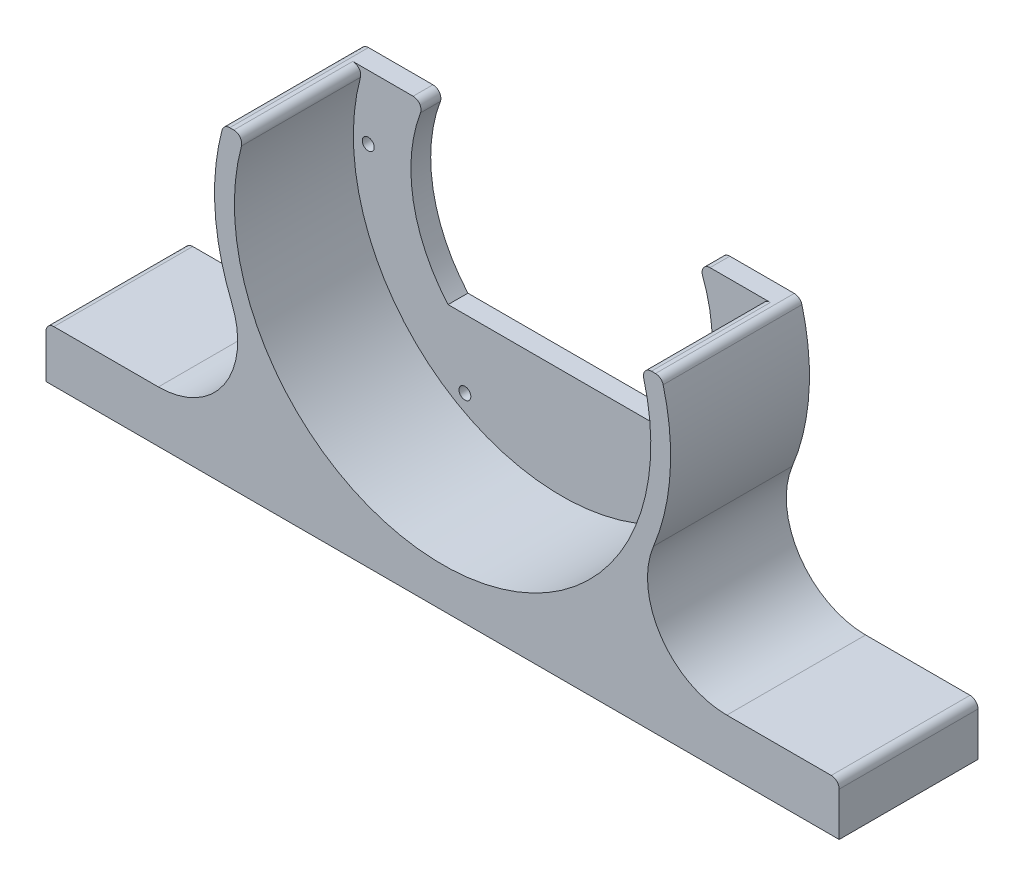
ISO-10303-21;
HEADER;
FILE_DESCRIPTION(('STEP AP214'),'2;1');
FILE_NAME('part.step','',(''),(''),'','','');
FILE_SCHEMA(('AUTOMOTIVE_DESIGN { 1 0 10303 214 1 1 1 1 }'));
ENDSEC;
DATA;
#1=APPLICATION_CONTEXT('core data for automotive mechanical design processes');
#2=APPLICATION_PROTOCOL_DEFINITION('international standard','automotive_design',2000,#1);
#3=PRODUCT_CONTEXT('',#1,'mechanical');
#4=PRODUCT('Part','Part','',(#3));
#5=PRODUCT_RELATED_PRODUCT_CATEGORY('part','',(#4));
#6=PRODUCT_DEFINITION_FORMATION('','',#4);
#7=PRODUCT_DEFINITION_CONTEXT('part definition',#1,'design');
#8=PRODUCT_DEFINITION('design','',#6,#7);
#9=PRODUCT_DEFINITION_SHAPE('','',#8);
#10=(LENGTH_UNIT() NAMED_UNIT(*) SI_UNIT(.MILLI.,.METRE.));
#11=(NAMED_UNIT(*) PLANE_ANGLE_UNIT() SI_UNIT($,.RADIAN.));
#12=(NAMED_UNIT(*) SI_UNIT($,.STERADIAN.) SOLID_ANGLE_UNIT());
#13=UNCERTAINTY_MEASURE_WITH_UNIT(LENGTH_MEASURE(1.E-05),#10,'distance_accuracy_value','');
#14=(GEOMETRIC_REPRESENTATION_CONTEXT(3) GLOBAL_UNCERTAINTY_ASSIGNED_CONTEXT((#13)) GLOBAL_UNIT_ASSIGNED_CONTEXT((#10,
#11,#12)) REPRESENTATION_CONTEXT('',''));
#15=CARTESIAN_POINT('',(0.,0.,0.));
#16=DIRECTION('',(0.,0.,1.));
#17=DIRECTION('',(1.,0.,0.));
#18=AXIS2_PLACEMENT_3D('',#15,#16,#17);
#19=CARTESIAN_POINT('',(0.,0.,35.));
#20=DIRECTION('',(0.,0.,-1.));
#21=DIRECTION('',(-1.,0.,0.));
#22=AXIS2_PLACEMENT_3D('',#19,#20,#21);
#23=CYLINDRICAL_SURFACE('',#22,57.5);
#24=CARTESIAN_POINT('',(0.,0.,35.));
#25=DIRECTION('',(0.,0.,1.));
#26=DIRECTION('',(1.,0.,0.));
#27=AXIS2_PLACEMENT_3D('',#24,#25,#26);
#28=CIRCLE('',#27,57.5);
#29=CARTESIAN_POINT('',(53.1714678638561,-21.8870967741936,35.));
#30=VERTEX_POINT('',#29);
#31=CARTESIAN_POINT('',(55.6134262341552,14.6081081081081,35.));
#32=VERTEX_POINT('',#31);
#33=EDGE_CURVE('E239',#30,#32,#28,.T.);
#34=ORIENTED_EDGE('',*,*,#33,.F.);
#35=DIRECTION('',(0.,0.,-1.));
#36=VECTOR('',#35,1.);
#37=CARTESIAN_POINT('',(53.1714678638562,-21.8870967741936,35.));
#38=LINE('',#37,#36);
#39=CARTESIAN_POINT('',(53.1714678638561,-21.8870967741936,0.));
#40=VERTEX_POINT('',#39);
#41=EDGE_CURVE('E364',#30,#40,#38,.T.);
#42=ORIENTED_EDGE('',*,*,#41,.T.);
#43=CARTESIAN_POINT('',(0.,0.,0.));
#44=DIRECTION('',(0.,0.,1.));
#45=DIRECTION('',(1.,0.,0.));
#46=AXIS2_PLACEMENT_3D('',#43,#44,#45);
#47=CIRCLE('',#46,57.5);
#48=CARTESIAN_POINT('',(55.6134262341552,14.6081081081081,0.));
#49=VERTEX_POINT('',#48);
#50=EDGE_CURVE('E230',#40,#49,#47,.T.);
#51=ORIENTED_EDGE('',*,*,#50,.T.);
#52=DIRECTION('',(0.,0.,-1.));
#53=VECTOR('',#52,1.);
#54=CARTESIAN_POINT('',(55.6134262341553,14.6081081081081,35.));
#55=LINE('',#54,#53);
#56=EDGE_CURVE('E330',#49,#32,#55,.F.);
#57=ORIENTED_EDGE('',*,*,#56,.T.);
#58=EDGE_LOOP('',(#34,#42,#51,#57));
#59=FACE_BOUND('',#58,.T.);
#60=ADVANCED_FACE('F35',(#59),#23,.T.);
#61=CARTESIAN_POINT('',(0.,0.,5.));
#62=DIRECTION('',(0.,0.,-1.));
#63=DIRECTION('',(-1.,0.,0.));
#64=AXIS2_PLACEMENT_3D('',#61,#62,#63);
#65=CYLINDRICAL_SURFACE('',#64,38.);
#66=CARTESIAN_POINT('',(0.,0.,0.));
#67=DIRECTION('',(0.,0.,1.));
#68=DIRECTION('',(1.,0.,0.));
#69=AXIS2_PLACEMENT_3D('',#66,#67,#68);
#70=CIRCLE('',#69,38.);
#71=CARTESIAN_POINT('',(-35.56084890719,13.395,0.));
#72=VERTEX_POINT('',#71);
#73=CARTESIAN_POINT('',(-28.6181760425084,-25.,0.));
#74=VERTEX_POINT('',#73);
#75=EDGE_CURVE('E289',#72,#74,#70,.T.);
#76=ORIENTED_EDGE('',*,*,#75,.F.);
#77=DIRECTION('',(0.,0.,-1.));
#78=VECTOR('',#77,1.);
#79=CARTESIAN_POINT('',(-35.56084890719,13.395,5.));
#80=LINE('',#79,#78);
#81=CARTESIAN_POINT('',(-35.56084890719,13.395,5.));
#82=VERTEX_POINT('',#81);
#83=EDGE_CURVE('E345',#72,#82,#80,.F.);
#84=ORIENTED_EDGE('',*,*,#83,.T.);
#85=CARTESIAN_POINT('',(0.,0.,5.));
#86=DIRECTION('',(0.,0.,1.));
#87=DIRECTION('',(1.,0.,0.));
#88=AXIS2_PLACEMENT_3D('',#85,#86,#87);
#89=CIRCLE('',#88,38.);
#90=CARTESIAN_POINT('',(-28.6181760425084,-25.,5.));
#91=VERTEX_POINT('',#90);
#92=EDGE_CURVE('E264',#82,#91,#89,.T.);
#93=ORIENTED_EDGE('',*,*,#92,.T.);
#94=DIRECTION('',(0.,0.,-1.));
#95=VECTOR('',#94,1.);
#96=CARTESIAN_POINT('',(-28.6181760425084,-25.,5.));
#97=LINE('',#96,#95);
#98=EDGE_CURVE('E277',#91,#74,#97,.T.);
#99=ORIENTED_EDGE('',*,*,#98,.T.);
#100=EDGE_LOOP('',(#76,#84,#93,#99));
#101=FACE_BOUND('',#100,.T.);
#102=ADVANCED_FACE('F484',(#101),#65,.F.);
#103=CARTESIAN_POINT('',(0.,16.1,5.));
#104=DIRECTION('',(0.,1.,0.));
#105=DIRECTION('',(-1.,0.,0.));
#106=AXIS2_PLACEMENT_3D('',#103,#104,#105);
#107=PLANE('',#106);
#108=DIRECTION('',(1.,0.,0.));
#109=VECTOR('',#108,1.);
#110=CARTESIAN_POINT('',(0.,16.1,35.));
#111=LINE('',#110,#109);
#112=CARTESIAN_POINT('',(-53.6790461912281,16.1,35.));
#113=VERTEX_POINT('',#112);
#114=CARTESIAN_POINT('',(-52.6444678954969,16.1,35.));
#115=VERTEX_POINT('',#114);
#116=EDGE_CURVE('E236',#113,#115,#111,.T.);
#117=ORIENTED_EDGE('',*,*,#116,.T.);
#118=DIRECTION('',(0.,0.,-1.));
#119=VECTOR('',#118,1.);
#120=CARTESIAN_POINT('',(-52.6444678954969,16.1,5.));
#121=LINE('',#120,#119);
#122=CARTESIAN_POINT('',(-52.6444678954969,16.1,5.));
#123=VERTEX_POINT('',#122);
#124=EDGE_CURVE('E327',#115,#123,#121,.T.);
#125=ORIENTED_EDGE('',*,*,#124,.T.);
#126=DIRECTION('',(1.,0.,0.));
#127=VECTOR('',#126,1.);
#128=CARTESIAN_POINT('',(0.,16.1,5.));
#129=LINE('',#128,#127);
#130=CARTESIAN_POINT('',(-37.4324725338843,16.1,5.));
#131=VERTEX_POINT('',#130);
#132=EDGE_CURVE('E266',#123,#131,#129,.T.);
#133=ORIENTED_EDGE('',*,*,#132,.T.);
#134=DIRECTION('',(0.,0.,-1.));
#135=VECTOR('',#134,1.);
#136=CARTESIAN_POINT('',(-37.4324725338843,16.1,5.));
#137=LINE('',#136,#135);
#138=CARTESIAN_POINT('',(-37.4324725338843,16.1,0.));
#139=VERTEX_POINT('',#138);
#140=EDGE_CURVE('E322',#131,#139,#137,.T.);
#141=ORIENTED_EDGE('',*,*,#140,.T.);
#142=DIRECTION('',(1.,0.,0.));
#143=VECTOR('',#142,1.);
#144=CARTESIAN_POINT('',(0.,16.1,0.));
#145=LINE('',#144,#143);
#146=CARTESIAN_POINT('',(-53.6790461912281,16.1,0.));
#147=VERTEX_POINT('',#146);
#148=EDGE_CURVE('E291',#147,#139,#145,.T.);
#149=ORIENTED_EDGE('',*,*,#148,.F.);
#150=DIRECTION('',(0.,0.,1.));
#151=VECTOR('',#150,1.);
#152=CARTESIAN_POINT('',(-53.6790461912281,16.1,35.));
#153=LINE('',#152,#151);
#154=EDGE_CURVE('E325',#147,#113,#153,.T.);
#155=ORIENTED_EDGE('',*,*,#154,.T.);
#156=EDGE_LOOP('',(#117,#125,#133,#141,#149,#155));
#157=FACE_BOUND('',#156,.T.);
#158=ADVANCED_FACE('F449',(#157),#107,.T.);
#159=CARTESIAN_POINT('',(37.4324725338843,16.1,5.));
#160=VERTEX_POINT('',#159);
#161=CARTESIAN_POINT('',(52.6444678954969,16.1,5.));
#162=VERTEX_POINT('',#161);
#163=EDGE_CURVE('E271',#160,#162,#129,.T.);
#164=ORIENTED_EDGE('',*,*,#163,.T.);
#165=DIRECTION('',(0.,0.,-1.));
#166=VECTOR('',#165,1.);
#167=CARTESIAN_POINT('',(52.6444678954969,16.1,5.));
#168=LINE('',#167,#166);
#169=CARTESIAN_POINT('',(52.6444678954969,16.1,35.));
#170=VERTEX_POINT('',#169);
#171=EDGE_CURVE('E312',#162,#170,#168,.F.);
#172=ORIENTED_EDGE('',*,*,#171,.T.);
#173=CARTESIAN_POINT('',(53.6790461912281,16.1,35.));
#174=VERTEX_POINT('',#173);
#175=EDGE_CURVE('E241',#170,#174,#111,.T.);
#176=ORIENTED_EDGE('',*,*,#175,.T.);
#177=DIRECTION('',(0.,0.,1.));
#178=VECTOR('',#177,1.);
#179=CARTESIAN_POINT('',(53.6790461912281,16.1,0.));
#180=LINE('',#179,#178);
#181=CARTESIAN_POINT('',(53.6790461912281,16.1,0.));
#182=VERTEX_POINT('',#181);
#183=EDGE_CURVE('E309',#174,#182,#180,.F.);
#184=ORIENTED_EDGE('',*,*,#183,.T.);
#185=CARTESIAN_POINT('',(37.4324725338843,16.1,0.));
#186=VERTEX_POINT('',#185);
#187=EDGE_CURVE('E295',#186,#182,#145,.T.);
#188=ORIENTED_EDGE('',*,*,#187,.F.);
#189=DIRECTION('',(0.,0.,-1.));
#190=VECTOR('',#189,1.);
#191=CARTESIAN_POINT('',(37.4324725338843,16.1,5.));
#192=LINE('',#191,#190);
#193=EDGE_CURVE('E307',#186,#160,#192,.F.);
#194=ORIENTED_EDGE('',*,*,#193,.T.);
#195=EDGE_LOOP('',(#164,#172,#176,#184,#188,#194));
#196=FACE_BOUND('',#195,.T.);
#197=ADVANCED_FACE('F412',(#196),#107,.T.);
#198=CARTESIAN_POINT('',(28.6181760425084,-25.,5.));
#199=VERTEX_POINT('',#198);
#200=CARTESIAN_POINT('',(35.56084890719,13.395,5.));
#201=VERTEX_POINT('',#200);
#202=EDGE_CURVE('E267',#199,#201,#89,.T.);
#203=ORIENTED_EDGE('',*,*,#202,.T.);
#204=DIRECTION('',(0.,0.,-1.));
#205=VECTOR('',#204,1.);
#206=CARTESIAN_POINT('',(35.56084890719,13.395,5.));
#207=LINE('',#206,#205);
#208=CARTESIAN_POINT('',(35.56084890719,13.395,0.));
#209=VERTEX_POINT('',#208);
#210=EDGE_CURVE('E351',#201,#209,#207,.T.);
#211=ORIENTED_EDGE('',*,*,#210,.T.);
#212=CARTESIAN_POINT('',(28.6181760425084,-25.,0.));
#213=VERTEX_POINT('',#212);
#214=EDGE_CURVE('E292',#213,#209,#70,.T.);
#215=ORIENTED_EDGE('',*,*,#214,.F.);
#216=DIRECTION('',(0.,0.,-1.));
#217=VECTOR('',#216,1.);
#218=CARTESIAN_POINT('',(28.6181760425084,-25.,5.));
#219=LINE('',#218,#217);
#220=EDGE_CURVE('E300',#199,#213,#219,.T.);
#221=ORIENTED_EDGE('',*,*,#220,.F.);
#222=EDGE_LOOP('',(#203,#211,#215,#221));
#223=FACE_BOUND('',#222,.T.);
#224=ADVANCED_FACE('F423',(#223),#65,.F.);
#225=CARTESIAN_POINT('',(-48.75,-1.159012122387E-13,5.));
#226=DIRECTION('',(0.,0.,-1.));
#227=DIRECTION('',(-1.,0.,0.));
#228=AXIS2_PLACEMENT_3D('',#225,#226,#227);
#229=CYLINDRICAL_SURFACE('',#228,1.5);
#230=CARTESIAN_POINT('',(-48.75,-1.159012122387E-13,5.));
#231=DIRECTION('',(0.,0.,1.));
#232=DIRECTION('',(1.,0.,0.));
#233=AXIS2_PLACEMENT_3D('',#230,#231,#232);
#234=CIRCLE('',#233,1.5);
#235=CARTESIAN_POINT('',(-47.25,-1.159012122387E-13,5.));
#236=VERTEX_POINT('',#235);
#237=EDGE_CURVE('E261',#236,#236,#234,.T.);
#238=ORIENTED_EDGE('',*,*,#237,.T.);
#239=EDGE_LOOP('',(#238));
#240=FACE_BOUND('',#239,.T.);
#241=CARTESIAN_POINT('',(-48.75,-1.159012122387E-13,0.));
#242=DIRECTION('',(0.,0.,1.));
#243=DIRECTION('',(1.,0.,0.));
#244=AXIS2_PLACEMENT_3D('',#241,#242,#243);
#245=CIRCLE('',#244,1.5);
#246=CARTESIAN_POINT('',(-47.25,-1.159012122387E-13,0.));
#247=VERTEX_POINT('',#246);
#248=EDGE_CURVE('E286',#247,#247,#245,.T.);
#249=ORIENTED_EDGE('',*,*,#248,.F.);
#250=EDGE_LOOP('',(#249));
#251=FACE_BOUND('',#250,.T.);
#252=ADVANCED_FACE('F512',(#240,#251),#229,.F.);
#253=CARTESIAN_POINT('',(48.75,-2.24518218298505E-13,5.));
#254=DIRECTION('',(0.,0.,-1.));
#255=DIRECTION('',(-1.,0.,0.));
#256=AXIS2_PLACEMENT_3D('',#253,#254,#255);
#257=CYLINDRICAL_SURFACE('',#256,1.49999999999999);
#258=CARTESIAN_POINT('',(48.75,-2.24518218298505E-13,5.));
#259=DIRECTION('',(0.,0.,1.));
#260=DIRECTION('',(1.,0.,0.));
#261=AXIS2_PLACEMENT_3D('',#258,#259,#260);
#262=CIRCLE('',#261,1.49999999999999);
#263=CARTESIAN_POINT('',(50.25,-2.24518218298505E-13,5.));
#264=VERTEX_POINT('',#263);
#265=EDGE_CURVE('E258',#264,#264,#262,.T.);
#266=ORIENTED_EDGE('',*,*,#265,.T.);
#267=EDGE_LOOP('',(#266));
#268=FACE_BOUND('',#267,.T.);
#269=CARTESIAN_POINT('',(48.75,-2.24518218298505E-13,0.));
#270=DIRECTION('',(0.,0.,1.));
#271=DIRECTION('',(1.,0.,0.));
#272=AXIS2_PLACEMENT_3D('',#269,#270,#271);
#273=CIRCLE('',#272,1.49999999999999);
#274=CARTESIAN_POINT('',(50.25,-2.24518218298505E-13,0.));
#275=VERTEX_POINT('',#274);
#276=EDGE_CURVE('E283',#275,#275,#273,.T.);
#277=ORIENTED_EDGE('',*,*,#276,.F.);
#278=EDGE_LOOP('',(#277));
#279=FACE_BOUND('',#278,.T.);
#280=ADVANCED_FACE('F517',(#268,#279),#257,.F.);
#281=CARTESIAN_POINT('',(24.3749999999997,-42.2187384344916,5.));
#282=DIRECTION('',(0.,0.,-1.));
#283=DIRECTION('',(-1.,0.,0.));
#284=AXIS2_PLACEMENT_3D('',#281,#282,#283);
#285=CYLINDRICAL_SURFACE('',#284,1.5);
#286=CARTESIAN_POINT('',(24.3749999999997,-42.2187384344916,5.));
#287=DIRECTION('',(0.,0.,1.));
#288=DIRECTION('',(1.,0.,0.));
#289=AXIS2_PLACEMENT_3D('',#286,#287,#288);
#290=CIRCLE('',#289,1.5);
#291=CARTESIAN_POINT('',(25.8749999999997,-42.2187384344916,5.));
#292=VERTEX_POINT('',#291);
#293=EDGE_CURVE('E254',#292,#292,#290,.T.);
#294=ORIENTED_EDGE('',*,*,#293,.T.);
#295=EDGE_LOOP('',(#294));
#296=FACE_BOUND('',#295,.T.);
#297=CARTESIAN_POINT('',(24.3749999999997,-42.2187384344916,0.));
#298=DIRECTION('',(0.,0.,1.));
#299=DIRECTION('',(1.,0.,0.));
#300=AXIS2_PLACEMENT_3D('',#297,#298,#299);
#301=CIRCLE('',#300,1.5);
#302=CARTESIAN_POINT('',(25.8749999999997,-42.2187384344916,0.));
#303=VERTEX_POINT('',#302);
#304=EDGE_CURVE('E280',#303,#303,#301,.T.);
#305=ORIENTED_EDGE('',*,*,#304,.F.);
#306=EDGE_LOOP('',(#305));
#307=FACE_BOUND('',#306,.T.);
#308=ADVANCED_FACE('F521',(#296,#307),#285,.F.);
#309=CARTESIAN_POINT('',(-24.3750000000004,-42.2187384344912,5.));
#310=DIRECTION('',(0.,0.,-1.));
#311=DIRECTION('',(-1.,0.,0.));
#312=AXIS2_PLACEMENT_3D('',#309,#310,#311);
#313=CYLINDRICAL_SURFACE('',#312,1.5);
#314=CARTESIAN_POINT('',(-24.3750000000004,-42.2187384344912,5.));
#315=DIRECTION('',(0.,0.,1.));
#316=DIRECTION('',(1.,0.,0.));
#317=AXIS2_PLACEMENT_3D('',#314,#315,#316);
#318=CIRCLE('',#317,1.5);
#319=CARTESIAN_POINT('',(-22.8750000000004,-42.2187384344912,5.));
#320=VERTEX_POINT('',#319);
#321=EDGE_CURVE('E251',#320,#320,#318,.T.);
#322=ORIENTED_EDGE('',*,*,#321,.T.);
#323=EDGE_LOOP('',(#322));
#324=FACE_BOUND('',#323,.T.);
#325=CARTESIAN_POINT('',(-24.3750000000004,-42.2187384344912,0.));
#326=DIRECTION('',(0.,0.,1.));
#327=DIRECTION('',(1.,0.,0.));
#328=AXIS2_PLACEMENT_3D('',#325,#326,#327);
#329=CIRCLE('',#328,1.5);
#330=CARTESIAN_POINT('',(-22.8750000000004,-42.2187384344912,0.));
#331=VERTEX_POINT('',#330);
#332=EDGE_CURVE('E248',#331,#331,#329,.T.);
#333=ORIENTED_EDGE('',*,*,#332,.F.);
#334=EDGE_LOOP('',(#333));
#335=FACE_BOUND('',#334,.T.);
#336=ADVANCED_FACE('F508',(#324,#335),#313,.F.);
#337=CARTESIAN_POINT('',(0.,-25.,5.));
#338=DIRECTION('',(0.,1.,0.));
#339=DIRECTION('',(0.,0.,1.));
#340=AXIS2_PLACEMENT_3D('',#337,#338,#339);
#341=PLANE('',#340);
#342=DIRECTION('',(1.,0.,0.));
#343=VECTOR('',#342,1.);
#344=CARTESIAN_POINT('',(0.,-25.,0.));
#345=LINE('',#344,#343);
#346=EDGE_CURVE('E255',#74,#213,#345,.T.);
#347=ORIENTED_EDGE('',*,*,#346,.F.);
#348=ORIENTED_EDGE('',*,*,#98,.F.);
#349=DIRECTION('',(1.,0.,0.));
#350=VECTOR('',#349,1.);
#351=CARTESIAN_POINT('',(0.,-25.,5.));
#352=LINE('',#351,#350);
#353=EDGE_CURVE('E274',#91,#199,#352,.T.);
#354=ORIENTED_EDGE('',*,*,#353,.T.);
#355=ORIENTED_EDGE('',*,*,#220,.T.);
#356=EDGE_LOOP('',(#347,#348,#354,#355));
#357=FACE_BOUND('',#356,.T.);
#358=ADVANCED_FACE('F503',(#357),#341,.T.);
#359=CARTESIAN_POINT('',(0.,0.,5.));
#360=DIRECTION('',(0.,0.,1.));
#361=DIRECTION('',(1.,0.,0.));
#362=AXIS2_PLACEMENT_3D('',#359,#360,#361);
#363=PLANE('',#362);
#364=ORIENTED_EDGE('',*,*,#321,.F.);
#365=EDGE_LOOP('',(#364));
#366=FACE_BOUND('',#365,.T.);
#367=ORIENTED_EDGE('',*,*,#293,.F.);
#368=EDGE_LOOP('',(#367));
#369=FACE_BOUND('',#368,.T.);
#370=ORIENTED_EDGE('',*,*,#265,.F.);
#371=EDGE_LOOP('',(#370));
#372=FACE_BOUND('',#371,.T.);
#373=ORIENTED_EDGE('',*,*,#237,.F.);
#374=EDGE_LOOP('',(#373));
#375=FACE_BOUND('',#374,.T.);
#376=ORIENTED_EDGE('',*,*,#92,.F.);
#377=CARTESIAN_POINT('',(-37.4324725338843,14.1,5.));
#378=DIRECTION('',(0.,0.,1.));
#379=DIRECTION('',(1.,0.,0.));
#380=AXIS2_PLACEMENT_3D('',#377,#378,#379);
#381=CIRCLE('',#380,2.);
#382=EDGE_CURVE('E349',#82,#131,#381,.T.);
#383=ORIENTED_EDGE('',*,*,#382,.T.);
#384=ORIENTED_EDGE('',*,*,#132,.F.);
#385=CARTESIAN_POINT('',(-52.6444678954969,14.1,5.));
#386=DIRECTION('',(0.,0.,1.));
#387=DIRECTION('',(1.,0.,0.));
#388=AXIS2_PLACEMENT_3D('',#385,#386,#387);
#389=CIRCLE('',#388,2.);
#390=CARTESIAN_POINT('',(-50.712560816763,13.5825688073394,5.));
#391=VERTEX_POINT('',#390);
#392=EDGE_CURVE('E357',#123,#391,#389,.F.);
#393=ORIENTED_EDGE('',*,*,#392,.T.);
#394=CARTESIAN_POINT('',(0.,0.,5.));
#395=DIRECTION('',(0.,0.,1.));
#396=DIRECTION('',(1.,0.,0.));
#397=AXIS2_PLACEMENT_3D('',#394,#395,#396);
#398=CIRCLE('',#397,52.5);
#399=CARTESIAN_POINT('',(50.712560816763,13.5825688073394,5.));
#400=VERTEX_POINT('',#399);
#401=EDGE_CURVE('E270',#391,#400,#398,.T.);
#402=ORIENTED_EDGE('',*,*,#401,.T.);
#403=CARTESIAN_POINT('',(52.6444678954969,14.1,5.));
#404=DIRECTION('',(0.,0.,1.));
#405=DIRECTION('',(1.,0.,0.));
#406=AXIS2_PLACEMENT_3D('',#403,#404,#405);
#407=CIRCLE('',#406,2.);
#408=EDGE_CURVE('E354',#400,#162,#407,.F.);
#409=ORIENTED_EDGE('',*,*,#408,.T.);
#410=ORIENTED_EDGE('',*,*,#163,.F.);
#411=CARTESIAN_POINT('',(37.4324725338843,14.1,5.));
#412=DIRECTION('',(0.,0.,1.));
#413=DIRECTION('',(1.,0.,0.));
#414=AXIS2_PLACEMENT_3D('',#411,#412,#413);
#415=CIRCLE('',#414,2.);
#416=EDGE_CURVE('E347',#160,#201,#415,.T.);
#417=ORIENTED_EDGE('',*,*,#416,.T.);
#418=ORIENTED_EDGE('',*,*,#202,.F.);
#419=ORIENTED_EDGE('',*,*,#353,.F.);
#420=EDGE_LOOP('',(#376,#383,#384,#393,#402,#409,#410,#417,#418,#419));
#421=FACE_BOUND('',#420,.T.);
#422=ADVANCED_FACE('F432',(#366,#369,#372,#375,#421),#363,.T.);
#423=CARTESIAN_POINT('',(0.,0.,0.));
#424=DIRECTION('',(0.,0.,1.));
#425=DIRECTION('',(1.,0.,0.));
#426=AXIS2_PLACEMENT_3D('',#423,#424,#425);
#427=PLANE('',#426);
#428=ORIENTED_EDGE('',*,*,#332,.T.);
#429=EDGE_LOOP('',(#428));
#430=FACE_BOUND('',#429,.T.);
#431=ORIENTED_EDGE('',*,*,#304,.T.);
#432=EDGE_LOOP('',(#431));
#433=FACE_BOUND('',#432,.T.);
#434=ORIENTED_EDGE('',*,*,#276,.T.);
#435=EDGE_LOOP('',(#434));
#436=FACE_BOUND('',#435,.T.);
#437=ORIENTED_EDGE('',*,*,#248,.T.);
#438=EDGE_LOOP('',(#437));
#439=FACE_BOUND('',#438,.T.);
#440=DIRECTION('',(0.,1.,0.));
#441=VECTOR('',#440,1.);
#442=CARTESIAN_POINT('',(-100.,0.,0.));
#443=LINE('',#442,#441);
#444=CARTESIAN_POINT('',(-100.,-62.5,0.));
#445=VERTEX_POINT('',#444);
#446=CARTESIAN_POINT('',(-100.,-51.5,0.));
#447=VERTEX_POINT('',#446);
#448=EDGE_CURVE('E223',#445,#447,#443,.T.);
#449=ORIENTED_EDGE('',*,*,#448,.T.);
#450=CARTESIAN_POINT('',(-98.,-51.5,0.));
#451=DIRECTION('',(0.,0.,1.));
#452=DIRECTION('',(1.,0.,0.));
#453=AXIS2_PLACEMENT_3D('',#450,#451,#452);
#454=CIRCLE('',#453,2.);
#455=CARTESIAN_POINT('',(-98.,-49.5,0.));
#456=VERTEX_POINT('',#455);
#457=EDGE_CURVE('E382',#447,#456,#454,.F.);
#458=ORIENTED_EDGE('',*,*,#457,.T.);
#459=DIRECTION('',(1.,0.,0.));
#460=VECTOR('',#459,1.);
#461=CARTESIAN_POINT('',(0.,-49.5,0.));
#462=LINE('',#461,#460);
#463=CARTESIAN_POINT('',(-71.6658914686757,-49.5,0.));
#464=VERTEX_POINT('',#463);
#465=EDGE_CURVE('E225',#456,#464,#462,.T.);
#466=ORIENTED_EDGE('',*,*,#465,.T.);
#467=CARTESIAN_POINT('',(-71.6658914686757,-29.5,0.));
#468=DIRECTION('',(0.,0.,1.));
#469=DIRECTION('',(1.,0.,0.));
#470=AXIS2_PLACEMENT_3D('',#467,#468,#469);
#471=CIRCLE('',#470,20.);
#472=CARTESIAN_POINT('',(-53.1714678638561,-21.8870967741936,0.));
#473=VERTEX_POINT('',#472);
#474=EDGE_CURVE('E369',#464,#473,#471,.T.);
#475=ORIENTED_EDGE('',*,*,#474,.T.);
#476=CARTESIAN_POINT('',(-55.6134262341552,14.6081081081081,0.));
#477=VERTEX_POINT('',#476);
#478=EDGE_CURVE('E240',#477,#473,#47,.T.);
#479=ORIENTED_EDGE('',*,*,#478,.F.);
#480=CARTESIAN_POINT('',(-53.6790461912281,14.1,0.));
#481=DIRECTION('',(0.,0.,1.));
#482=DIRECTION('',(1.,0.,0.));
#483=AXIS2_PLACEMENT_3D('',#480,#481,#482);
#484=CIRCLE('',#483,2.);
#485=EDGE_CURVE('E343',#477,#147,#484,.F.);
#486=ORIENTED_EDGE('',*,*,#485,.T.);
#487=ORIENTED_EDGE('',*,*,#148,.T.);
#488=CARTESIAN_POINT('',(-37.4324725338843,14.1,0.));
#489=DIRECTION('',(0.,0.,1.));
#490=DIRECTION('',(1.,0.,0.));
#491=AXIS2_PLACEMENT_3D('',#488,#489,#490);
#492=CIRCLE('',#491,2.);
#493=EDGE_CURVE('E338',#139,#72,#492,.F.);
#494=ORIENTED_EDGE('',*,*,#493,.T.);
#495=ORIENTED_EDGE('',*,*,#75,.T.);
#496=ORIENTED_EDGE('',*,*,#346,.T.);
#497=ORIENTED_EDGE('',*,*,#214,.T.);
#498=CARTESIAN_POINT('',(37.4324725338843,14.1,0.));
#499=DIRECTION('',(0.,0.,1.));
#500=DIRECTION('',(1.,0.,0.));
#501=AXIS2_PLACEMENT_3D('',#498,#499,#500);
#502=CIRCLE('',#501,2.);
#503=EDGE_CURVE('E336',#209,#186,#502,.F.);
#504=ORIENTED_EDGE('',*,*,#503,.T.);
#505=ORIENTED_EDGE('',*,*,#187,.T.);
#506=CARTESIAN_POINT('',(53.6790461912281,14.1,0.));
#507=DIRECTION('',(0.,0.,1.));
#508=DIRECTION('',(1.,0.,0.));
#509=AXIS2_PLACEMENT_3D('',#506,#507,#508);
#510=CIRCLE('',#509,2.);
#511=EDGE_CURVE('E340',#182,#49,#510,.F.);
#512=ORIENTED_EDGE('',*,*,#511,.T.);
#513=ORIENTED_EDGE('',*,*,#50,.F.);
#514=CARTESIAN_POINT('',(71.6658914686757,-29.5,0.));
#515=DIRECTION('',(0.,0.,1.));
#516=DIRECTION('',(1.,0.,0.));
#517=AXIS2_PLACEMENT_3D('',#514,#515,#516);
#518=CIRCLE('',#517,20.);
#519=CARTESIAN_POINT('',(71.6658914686757,-49.5,0.));
#520=VERTEX_POINT('',#519);
#521=EDGE_CURVE('E374',#40,#520,#518,.T.);
#522=ORIENTED_EDGE('',*,*,#521,.T.);
#523=DIRECTION('',(1.,0.,0.));
#524=VECTOR('',#523,1.);
#525=CARTESIAN_POINT('',(0.,-49.5,0.));
#526=LINE('',#525,#524);
#527=CARTESIAN_POINT('',(98.,-49.5,0.));
#528=VERTEX_POINT('',#527);
#529=EDGE_CURVE('E221',#520,#528,#526,.T.);
#530=ORIENTED_EDGE('',*,*,#529,.T.);
#531=CARTESIAN_POINT('',(98.,-51.5,0.));
#532=DIRECTION('',(0.,0.,1.));
#533=DIRECTION('',(1.,0.,0.));
#534=AXIS2_PLACEMENT_3D('',#531,#532,#533);
#535=CIRCLE('',#534,2.);
#536=CARTESIAN_POINT('',(100.,-51.5,0.));
#537=VERTEX_POINT('',#536);
#538=EDGE_CURVE('E217',#528,#537,#535,.F.);
#539=ORIENTED_EDGE('',*,*,#538,.T.);
#540=DIRECTION('',(0.,1.,0.));
#541=VECTOR('',#540,1.);
#542=CARTESIAN_POINT('',(100.,0.,0.));
#543=LINE('',#542,#541);
#544=CARTESIAN_POINT('',(100.,-62.5,0.));
#545=VERTEX_POINT('',#544);
#546=EDGE_CURVE('E199',#545,#537,#543,.T.);
#547=ORIENTED_EDGE('',*,*,#546,.F.);
#548=DIRECTION('',(1.,0.,0.));
#549=VECTOR('',#548,1.);
#550=CARTESIAN_POINT('',(0.,-62.5,0.));
#551=LINE('',#550,#549);
#552=EDGE_CURVE('E206',#445,#545,#551,.T.);
#553=ORIENTED_EDGE('',*,*,#552,.F.);
#554=EDGE_LOOP('',(#449,#458,#466,#475,#479,#486,#487,#494,#495,#496,#497,#504,#505,#512,#513,
#522,#530,#539,#547,#553));
#555=FACE_BOUND('',#554,.T.);
#556=ADVANCED_FACE('F215',(#430,#433,#436,#439,#555),#427,.F.);
#557=ORIENTED_EDGE('',*,*,#478,.T.);
#558=DIRECTION('',(0.,0.,-1.));
#559=VECTOR('',#558,1.);
#560=CARTESIAN_POINT('',(-53.1714678638562,-21.8870967741936,35.));
#561=LINE('',#560,#559);
#562=CARTESIAN_POINT('',(-53.1714678638561,-21.8870967741936,35.));
#563=VERTEX_POINT('',#562);
#564=EDGE_CURVE('E362',#473,#563,#561,.F.);
#565=ORIENTED_EDGE('',*,*,#564,.T.);
#566=CARTESIAN_POINT('',(-55.6134262341552,14.6081081081081,35.));
#567=VERTEX_POINT('',#566);
#568=EDGE_CURVE('E242',#567,#563,#28,.T.);
#569=ORIENTED_EDGE('',*,*,#568,.F.);
#570=DIRECTION('',(0.,0.,-1.));
#571=VECTOR('',#570,1.);
#572=CARTESIAN_POINT('',(-55.6134262341553,14.6081081081081,35.));
#573=LINE('',#572,#571);
#574=EDGE_CURVE('E333',#567,#477,#573,.T.);
#575=ORIENTED_EDGE('',*,*,#574,.T.);
#576=EDGE_LOOP('',(#557,#565,#569,#575));
#577=FACE_BOUND('',#576,.T.);
#578=ADVANCED_FACE('F458',(#577),#23,.T.);
#579=CARTESIAN_POINT('',(0.,0.,35.));
#580=DIRECTION('',(0.,0.,-1.));
#581=DIRECTION('',(-1.,0.,0.));
#582=AXIS2_PLACEMENT_3D('',#579,#580,#581);
#583=CYLINDRICAL_SURFACE('',#582,52.5);
#584=CARTESIAN_POINT('',(0.,0.,35.));
#585=DIRECTION('',(0.,0.,1.));
#586=DIRECTION('',(1.,0.,0.));
#587=AXIS2_PLACEMENT_3D('',#584,#585,#586);
#588=CIRCLE('',#587,52.5);
#589=CARTESIAN_POINT('',(-50.712560816763,13.5825688073394,35.));
#590=VERTEX_POINT('',#589);
#591=CARTESIAN_POINT('',(50.712560816763,13.5825688073394,35.));
#592=VERTEX_POINT('',#591);
#593=EDGE_CURVE('E245',#590,#592,#588,.T.);
#594=ORIENTED_EDGE('',*,*,#593,.T.);
#595=DIRECTION('',(0.,0.,-1.));
#596=VECTOR('',#595,1.);
#597=CARTESIAN_POINT('',(50.712560816763,13.5825688073394,35.));
#598=LINE('',#597,#596);
#599=EDGE_CURVE('E304',#592,#400,#598,.T.);
#600=ORIENTED_EDGE('',*,*,#599,.T.);
#601=ORIENTED_EDGE('',*,*,#401,.F.);
#602=DIRECTION('',(0.,0.,-1.));
#603=VECTOR('',#602,1.);
#604=CARTESIAN_POINT('',(-50.712560816763,13.5825688073394,35.));
#605=LINE('',#604,#603);
#606=EDGE_CURVE('E302',#391,#590,#605,.F.);
#607=ORIENTED_EDGE('',*,*,#606,.T.);
#608=EDGE_LOOP('',(#594,#600,#601,#607));
#609=FACE_BOUND('',#608,.T.);
#610=ADVANCED_FACE('F440',(#609),#583,.F.);
#611=CARTESIAN_POINT('',(0.,0.,35.));
#612=DIRECTION('',(0.,0.,1.));
#613=DIRECTION('',(1.,0.,0.));
#614=AXIS2_PLACEMENT_3D('',#611,#612,#613);
#615=PLANE('',#614);
#616=DIRECTION('',(1.,0.,0.));
#617=VECTOR('',#616,1.);
#618=CARTESIAN_POINT('',(0.,-49.5,35.));
#619=LINE('',#618,#617);
#620=CARTESIAN_POINT('',(-98.,-49.5,35.));
#621=VERTEX_POINT('',#620);
#622=CARTESIAN_POINT('',(-71.6658914686757,-49.5,35.));
#623=VERTEX_POINT('',#622);
#624=EDGE_CURVE('E228',#621,#623,#619,.T.);
#625=ORIENTED_EDGE('',*,*,#624,.F.);
#626=CARTESIAN_POINT('',(-98.,-51.5,35.));
#627=DIRECTION('',(0.,0.,1.));
#628=DIRECTION('',(1.,0.,0.));
#629=AXIS2_PLACEMENT_3D('',#626,#627,#628);
#630=CIRCLE('',#629,2.);
#631=CARTESIAN_POINT('',(-100.,-51.5,35.));
#632=VERTEX_POINT('',#631);
#633=EDGE_CURVE('E387',#621,#632,#630,.T.);
#634=ORIENTED_EDGE('',*,*,#633,.T.);
#635=DIRECTION('',(0.,1.,0.));
#636=VECTOR('',#635,1.);
#637=CARTESIAN_POINT('',(-100.,0.,35.));
#638=LINE('',#637,#636);
#639=CARTESIAN_POINT('',(-100.,-62.5,35.));
#640=VERTEX_POINT('',#639);
#641=EDGE_CURVE('E213',#640,#632,#638,.T.);
#642=ORIENTED_EDGE('',*,*,#641,.F.);
#643=DIRECTION('',(1.,0.,0.));
#644=VECTOR('',#643,1.);
#645=CARTESIAN_POINT('',(0.,-62.5,35.));
#646=LINE('',#645,#644);
#647=CARTESIAN_POINT('',(100.,-62.5,35.));
#648=VERTEX_POINT('',#647);
#649=EDGE_CURVE('E233',#640,#648,#646,.T.);
#650=ORIENTED_EDGE('',*,*,#649,.T.);
#651=DIRECTION('',(0.,1.,0.));
#652=VECTOR('',#651,1.);
#653=CARTESIAN_POINT('',(100.,0.,35.));
#654=LINE('',#653,#652);
#655=CARTESIAN_POINT('',(100.,-51.5,35.));
#656=VERTEX_POINT('',#655);
#657=EDGE_CURVE('E200',#648,#656,#654,.T.);
#658=ORIENTED_EDGE('',*,*,#657,.T.);
#659=CARTESIAN_POINT('',(98.,-51.5,35.));
#660=DIRECTION('',(0.,0.,1.));
#661=DIRECTION('',(1.,0.,0.));
#662=AXIS2_PLACEMENT_3D('',#659,#660,#661);
#663=CIRCLE('',#662,2.);
#664=CARTESIAN_POINT('',(98.,-49.5,35.));
#665=VERTEX_POINT('',#664);
#666=EDGE_CURVE('E50',#656,#665,#663,.T.);
#667=ORIENTED_EDGE('',*,*,#666,.T.);
#668=DIRECTION('',(1.,0.,0.));
#669=VECTOR('',#668,1.);
#670=CARTESIAN_POINT('',(0.,-49.5,35.));
#671=LINE('',#670,#669);
#672=CARTESIAN_POINT('',(71.6658914686757,-49.5,35.));
#673=VERTEX_POINT('',#672);
#674=EDGE_CURVE('E203',#673,#665,#671,.T.);
#675=ORIENTED_EDGE('',*,*,#674,.F.);
#676=CARTESIAN_POINT('',(71.6658914686757,-29.5,35.));
#677=DIRECTION('',(0.,0.,1.));
#678=DIRECTION('',(1.,0.,0.));
#679=AXIS2_PLACEMENT_3D('',#676,#677,#678);
#680=CIRCLE('',#679,20.);
#681=EDGE_CURVE('E376',#673,#30,#680,.F.);
#682=ORIENTED_EDGE('',*,*,#681,.T.);
#683=ORIENTED_EDGE('',*,*,#33,.T.);
#684=CARTESIAN_POINT('',(53.6790461912281,14.1,35.));
#685=DIRECTION('',(0.,0.,1.));
#686=DIRECTION('',(1.,0.,0.));
#687=AXIS2_PLACEMENT_3D('',#684,#685,#686);
#688=CIRCLE('',#687,2.);
#689=EDGE_CURVE('E314',#32,#174,#688,.T.);
#690=ORIENTED_EDGE('',*,*,#689,.T.);
#691=ORIENTED_EDGE('',*,*,#175,.F.);
#692=CARTESIAN_POINT('',(52.6444678954969,14.1,35.));
#693=DIRECTION('',(0.,0.,1.));
#694=DIRECTION('',(1.,0.,0.));
#695=AXIS2_PLACEMENT_3D('',#692,#693,#694);
#696=CIRCLE('',#695,2.);
#697=EDGE_CURVE('E320',#170,#592,#696,.T.);
#698=ORIENTED_EDGE('',*,*,#697,.T.);
#699=ORIENTED_EDGE('',*,*,#593,.F.);
#700=CARTESIAN_POINT('',(-52.6444678954969,14.1,35.));
#701=DIRECTION('',(0.,0.,1.));
#702=DIRECTION('',(1.,0.,0.));
#703=AXIS2_PLACEMENT_3D('',#700,#701,#702);
#704=CIRCLE('',#703,2.);
#705=EDGE_CURVE('E318',#590,#115,#704,.T.);
#706=ORIENTED_EDGE('',*,*,#705,.T.);
#707=ORIENTED_EDGE('',*,*,#116,.F.);
#708=CARTESIAN_POINT('',(-53.6790461912281,14.1,35.));
#709=DIRECTION('',(0.,0.,1.));
#710=DIRECTION('',(1.,0.,0.));
#711=AXIS2_PLACEMENT_3D('',#708,#709,#710);
#712=CIRCLE('',#711,2.);
#713=EDGE_CURVE('E316',#113,#567,#712,.T.);
#714=ORIENTED_EDGE('',*,*,#713,.T.);
#715=ORIENTED_EDGE('',*,*,#568,.T.);
#716=CARTESIAN_POINT('',(-71.6658914686757,-29.5,35.));
#717=DIRECTION('',(0.,0.,1.));
#718=DIRECTION('',(1.,0.,0.));
#719=AXIS2_PLACEMENT_3D('',#716,#717,#718);
#720=CIRCLE('',#719,20.);
#721=EDGE_CURVE('E371',#563,#623,#720,.F.);
#722=ORIENTED_EDGE('',*,*,#721,.T.);
#723=EDGE_LOOP('',(#625,#634,#642,#650,#658,#667,#675,#682,#683,#690,#691,#698,#699,#706,#707,
#714,#715,#722));
#724=FACE_BOUND('',#723,.T.);
#725=ADVANCED_FACE('F405',(#724),#615,.T.);
#726=CARTESIAN_POINT('',(52.6444678954969,14.1,35.));
#727=DIRECTION('',(0.,0.,-1.));
#728=DIRECTION('',(-1.,0.,0.));
#729=AXIS2_PLACEMENT_3D('',#726,#727,#728);
#730=CYLINDRICAL_SURFACE('',#729,2.);
#731=ORIENTED_EDGE('',*,*,#697,.F.);
#732=ORIENTED_EDGE('',*,*,#171,.F.);
#733=ORIENTED_EDGE('',*,*,#408,.F.);
#734=ORIENTED_EDGE('',*,*,#599,.F.);
#735=EDGE_LOOP('',(#731,#732,#733,#734));
#736=FACE_BOUND('',#735,.T.);
#737=ADVANCED_FACE('F436',(#736),#730,.T.);
#738=CARTESIAN_POINT('',(-52.6444678954969,14.1,35.));
#739=DIRECTION('',(0.,0.,-1.));
#740=DIRECTION('',(-1.,0.,0.));
#741=AXIS2_PLACEMENT_3D('',#738,#739,#740);
#742=CYLINDRICAL_SURFACE('',#741,2.);
#743=ORIENTED_EDGE('',*,*,#705,.F.);
#744=ORIENTED_EDGE('',*,*,#606,.F.);
#745=ORIENTED_EDGE('',*,*,#392,.F.);
#746=ORIENTED_EDGE('',*,*,#124,.F.);
#747=EDGE_LOOP('',(#743,#744,#745,#746));
#748=FACE_BOUND('',#747,.T.);
#749=ADVANCED_FACE('F444',(#748),#742,.T.);
#750=CARTESIAN_POINT('',(-53.6790461912281,14.1,35.));
#751=DIRECTION('',(0.,0.,-1.));
#752=DIRECTION('',(-1.,0.,0.));
#753=AXIS2_PLACEMENT_3D('',#750,#751,#752);
#754=CYLINDRICAL_SURFACE('',#753,2.);
#755=ORIENTED_EDGE('',*,*,#713,.F.);
#756=ORIENTED_EDGE('',*,*,#154,.F.);
#757=ORIENTED_EDGE('',*,*,#485,.F.);
#758=ORIENTED_EDGE('',*,*,#574,.F.);
#759=EDGE_LOOP('',(#755,#756,#757,#758));
#760=FACE_BOUND('',#759,.T.);
#761=ADVANCED_FACE('F453',(#760),#754,.T.);
#762=CARTESIAN_POINT('',(53.6790461912281,14.1,35.));
#763=DIRECTION('',(0.,0.,-1.));
#764=DIRECTION('',(-1.,0.,0.));
#765=AXIS2_PLACEMENT_3D('',#762,#763,#764);
#766=CYLINDRICAL_SURFACE('',#765,2.);
#767=ORIENTED_EDGE('',*,*,#689,.F.);
#768=ORIENTED_EDGE('',*,*,#56,.F.);
#769=ORIENTED_EDGE('',*,*,#511,.F.);
#770=ORIENTED_EDGE('',*,*,#183,.F.);
#771=EDGE_LOOP('',(#767,#768,#769,#770));
#772=FACE_BOUND('',#771,.T.);
#773=ADVANCED_FACE('F416',(#772),#766,.T.);
#774=CARTESIAN_POINT('',(-37.4324725338843,14.1,5.));
#775=DIRECTION('',(0.,0.,-1.));
#776=DIRECTION('',(-1.,0.,0.));
#777=AXIS2_PLACEMENT_3D('',#774,#775,#776);
#778=CYLINDRICAL_SURFACE('',#777,2.);
#779=ORIENTED_EDGE('',*,*,#382,.F.);
#780=ORIENTED_EDGE('',*,*,#83,.F.);
#781=ORIENTED_EDGE('',*,*,#493,.F.);
#782=ORIENTED_EDGE('',*,*,#140,.F.);
#783=EDGE_LOOP('',(#779,#780,#781,#782));
#784=FACE_BOUND('',#783,.T.);
#785=ADVANCED_FACE('F537',(#784),#778,.T.);
#786=CARTESIAN_POINT('',(37.4324725338843,14.1,5.));
#787=DIRECTION('',(0.,0.,-1.));
#788=DIRECTION('',(-1.,0.,0.));
#789=AXIS2_PLACEMENT_3D('',#786,#787,#788);
#790=CYLINDRICAL_SURFACE('',#789,2.);
#791=ORIENTED_EDGE('',*,*,#416,.F.);
#792=ORIENTED_EDGE('',*,*,#193,.F.);
#793=ORIENTED_EDGE('',*,*,#503,.F.);
#794=ORIENTED_EDGE('',*,*,#210,.F.);
#795=EDGE_LOOP('',(#791,#792,#793,#794));
#796=FACE_BOUND('',#795,.T.);
#797=ADVANCED_FACE('F428',(#796),#790,.T.);
#798=CARTESIAN_POINT('',(0.,-49.5,235.422054674629));
#799=DIRECTION('',(0.,1.,0.));
#800=DIRECTION('',(-1.,0.,0.));
#801=AXIS2_PLACEMENT_3D('',#798,#799,#800);
#802=PLANE('',#801);
#803=ORIENTED_EDGE('',*,*,#674,.T.);
#804=DIRECTION('',(0.,0.,-1.));
#805=VECTOR('',#804,1.);
#806=CARTESIAN_POINT('',(98.,-49.5,0.));
#807=LINE('',#806,#805);
#808=EDGE_CURVE('E43',#665,#528,#807,.T.);
#809=ORIENTED_EDGE('',*,*,#808,.T.);
#810=ORIENTED_EDGE('',*,*,#529,.F.);
#811=DIRECTION('',(0.,0.,-1.));
#812=VECTOR('',#811,1.);
#813=CARTESIAN_POINT('',(71.6658914686757,-49.5,235.422054674629));
#814=LINE('',#813,#812);
#815=EDGE_CURVE('E367',#520,#673,#814,.F.);
#816=ORIENTED_EDGE('',*,*,#815,.T.);
#817=EDGE_LOOP('',(#803,#809,#810,#816));
#818=FACE_BOUND('',#817,.T.);
#819=ADVANCED_FACE('F392',(#818),#802,.T.);
#820=CARTESIAN_POINT('',(100.,0.,235.422054674629));
#821=DIRECTION('',(-1.,0.,0.));
#822=DIRECTION('',(0.,0.,1.));
#823=AXIS2_PLACEMENT_3D('',#820,#821,#822);
#824=PLANE('',#823);
#825=ORIENTED_EDGE('',*,*,#546,.T.);
#826=DIRECTION('',(0.,0.,-1.));
#827=VECTOR('',#826,1.);
#828=CARTESIAN_POINT('',(100.,-51.5,35.));
#829=LINE('',#828,#827);
#830=EDGE_CURVE('E11',#537,#656,#829,.F.);
#831=ORIENTED_EDGE('',*,*,#830,.T.);
#832=ORIENTED_EDGE('',*,*,#657,.F.);
#833=DIRECTION('',(0.,0.,-1.));
#834=VECTOR('',#833,1.);
#835=CARTESIAN_POINT('',(100.,-62.5,235.422054674629));
#836=LINE('',#835,#834);
#837=EDGE_CURVE('E195',#648,#545,#836,.T.);
#838=ORIENTED_EDGE('',*,*,#837,.T.);
#839=EDGE_LOOP('',(#825,#831,#832,#838));
#840=FACE_BOUND('',#839,.T.);
#841=ADVANCED_FACE('F197',(#840),#824,.F.);
#842=CARTESIAN_POINT('',(0.,-62.5,235.422054674629));
#843=DIRECTION('',(0.,1.,0.));
#844=DIRECTION('',(0.,0.,1.));
#845=AXIS2_PLACEMENT_3D('',#842,#843,#844);
#846=PLANE('',#845);
#847=ORIENTED_EDGE('',*,*,#649,.F.);
#848=DIRECTION('',(0.,0.,-1.));
#849=VECTOR('',#848,1.);
#850=CARTESIAN_POINT('',(-100.,-62.5,235.422054674629));
#851=LINE('',#850,#849);
#852=EDGE_CURVE('E209',#640,#445,#851,.T.);
#853=ORIENTED_EDGE('',*,*,#852,.T.);
#854=ORIENTED_EDGE('',*,*,#552,.T.);
#855=ORIENTED_EDGE('',*,*,#837,.F.);
#856=EDGE_LOOP('',(#847,#853,#854,#855));
#857=FACE_BOUND('',#856,.T.);
#858=ADVANCED_FACE('F207',(#857),#846,.F.);
#859=CARTESIAN_POINT('',(-100.,0.,235.422054674629));
#860=DIRECTION('',(-1.,0.,0.));
#861=DIRECTION('',(0.,0.,1.));
#862=AXIS2_PLACEMENT_3D('',#859,#860,#861);
#863=PLANE('',#862);
#864=ORIENTED_EDGE('',*,*,#641,.T.);
#865=DIRECTION('',(0.,0.,-1.));
#866=VECTOR('',#865,1.);
#867=CARTESIAN_POINT('',(-100.,-51.5,235.422054674629));
#868=LINE('',#867,#866);
#869=EDGE_CURVE('E378',#632,#447,#868,.T.);
#870=ORIENTED_EDGE('',*,*,#869,.T.);
#871=ORIENTED_EDGE('',*,*,#448,.F.);
#872=ORIENTED_EDGE('',*,*,#852,.F.);
#873=EDGE_LOOP('',(#864,#870,#871,#872));
#874=FACE_BOUND('',#873,.T.);
#875=ADVANCED_FACE('F472',(#874),#863,.T.);
#876=CARTESIAN_POINT('',(0.,-49.5,235.422054674629));
#877=DIRECTION('',(0.,1.,0.));
#878=DIRECTION('',(-1.,0.,0.));
#879=AXIS2_PLACEMENT_3D('',#876,#877,#878);
#880=PLANE('',#879);
#881=ORIENTED_EDGE('',*,*,#465,.F.);
#882=DIRECTION('',(0.,0.,-1.));
#883=VECTOR('',#882,1.);
#884=CARTESIAN_POINT('',(-98.,-49.5,235.422054674629));
#885=LINE('',#884,#883);
#886=EDGE_CURVE('E384',#456,#621,#885,.F.);
#887=ORIENTED_EDGE('',*,*,#886,.T.);
#888=ORIENTED_EDGE('',*,*,#624,.T.);
#889=DIRECTION('',(0.,0.,-1.));
#890=VECTOR('',#889,1.);
#891=CARTESIAN_POINT('',(-71.6658914686757,-49.5,235.422054674629));
#892=LINE('',#891,#890);
#893=EDGE_CURVE('E359',#623,#464,#892,.T.);
#894=ORIENTED_EDGE('',*,*,#893,.T.);
#895=EDGE_LOOP('',(#881,#887,#888,#894));
#896=FACE_BOUND('',#895,.T.);
#897=ADVANCED_FACE('F474',(#896),#880,.T.);
#898=CARTESIAN_POINT('',(-71.6658914686757,-29.5,35.));
#899=DIRECTION('',(0.,0.,-1.));
#900=DIRECTION('',(-1.,0.,0.));
#901=AXIS2_PLACEMENT_3D('',#898,#899,#900);
#902=CYLINDRICAL_SURFACE('',#901,20.);
#903=ORIENTED_EDGE('',*,*,#721,.F.);
#904=ORIENTED_EDGE('',*,*,#564,.F.);
#905=ORIENTED_EDGE('',*,*,#474,.F.);
#906=ORIENTED_EDGE('',*,*,#893,.F.);
#907=EDGE_LOOP('',(#903,#904,#905,#906));
#908=FACE_BOUND('',#907,.T.);
#909=ADVANCED_FACE('F463',(#908),#902,.F.);
#910=CARTESIAN_POINT('',(71.6658914686757,-29.5,35.));
#911=DIRECTION('',(0.,0.,-1.));
#912=DIRECTION('',(-1.,0.,0.));
#913=AXIS2_PLACEMENT_3D('',#910,#911,#912);
#914=CYLINDRICAL_SURFACE('',#913,20.);
#915=ORIENTED_EDGE('',*,*,#681,.F.);
#916=ORIENTED_EDGE('',*,*,#815,.F.);
#917=ORIENTED_EDGE('',*,*,#521,.F.);
#918=ORIENTED_EDGE('',*,*,#41,.F.);
#919=EDGE_LOOP('',(#915,#916,#917,#918));
#920=FACE_BOUND('',#919,.T.);
#921=ADVANCED_FACE('F399',(#920),#914,.F.);
#922=CARTESIAN_POINT('',(-98.,-51.5,235.422054674629));
#923=DIRECTION('',(0.,0.,-1.));
#924=DIRECTION('',(-1.,0.,0.));
#925=AXIS2_PLACEMENT_3D('',#922,#923,#924);
#926=CYLINDRICAL_SURFACE('',#925,2.);
#927=ORIENTED_EDGE('',*,*,#633,.F.);
#928=ORIENTED_EDGE('',*,*,#886,.F.);
#929=ORIENTED_EDGE('',*,*,#457,.F.);
#930=ORIENTED_EDGE('',*,*,#869,.F.);
#931=EDGE_LOOP('',(#927,#928,#929,#930));
#932=FACE_BOUND('',#931,.T.);
#933=ADVANCED_FACE('F470',(#932),#926,.T.);
#934=CARTESIAN_POINT('',(98.,-51.5,235.422054674629));
#935=DIRECTION('',(0.,0.,1.));
#936=DIRECTION('',(1.,0.,0.));
#937=AXIS2_PLACEMENT_3D('',#934,#935,#936);
#938=CYLINDRICAL_SURFACE('',#937,2.);
#939=ORIENTED_EDGE('',*,*,#666,.F.);
#940=ORIENTED_EDGE('',*,*,#830,.F.);
#941=ORIENTED_EDGE('',*,*,#538,.F.);
#942=ORIENTED_EDGE('',*,*,#808,.F.);
#943=EDGE_LOOP('',(#939,#940,#941,#942));
#944=FACE_BOUND('',#943,.T.);
#945=ADVANCED_FACE('F37',(#944),#938,.T.);
#946=CLOSED_SHELL('',(#60,#102,#158,#197,#224,#252,#280,#308,#336,#358,#422,#556,#578,#610,#725,
#737,#749,#761,#773,#785,#797,#819,#841,#858,#875,#897,#909,#921,#933,#945));
#947=MANIFOLD_SOLID_BREP('B2',#946);
#948=ADVANCED_BREP_SHAPE_REPRESENTATION('',(#18,#947),#14);
#949=SHAPE_DEFINITION_REPRESENTATION(#9,#948);
ENDSEC;
END-ISO-10303-21;
